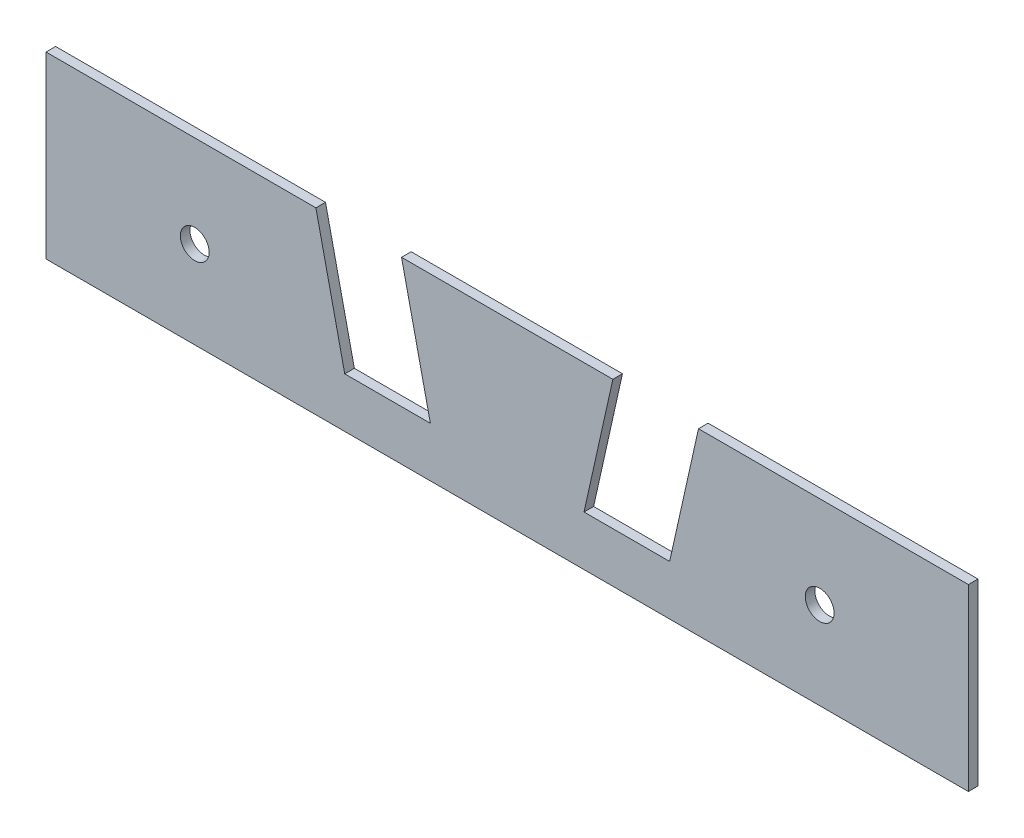
ISO-10303-21;
HEADER;
FILE_DESCRIPTION(('STEP AP214'),'2;1');
FILE_NAME('part.step','',(''),(''),'','','');
FILE_SCHEMA(('AUTOMOTIVE_DESIGN { 1 0 10303 214 1 1 1 1 }'));
ENDSEC;
DATA;
#1=APPLICATION_CONTEXT('core data for automotive mechanical design processes');
#2=APPLICATION_PROTOCOL_DEFINITION('international standard','automotive_design',2000,#1);
#3=PRODUCT_CONTEXT('',#1,'mechanical');
#4=PRODUCT('Part','Part','',(#3));
#5=PRODUCT_RELATED_PRODUCT_CATEGORY('part','',(#4));
#6=PRODUCT_DEFINITION_FORMATION('','',#4);
#7=PRODUCT_DEFINITION_CONTEXT('part definition',#1,'design');
#8=PRODUCT_DEFINITION('design','',#6,#7);
#9=PRODUCT_DEFINITION_SHAPE('','',#8);
#10=(LENGTH_UNIT() NAMED_UNIT(*) SI_UNIT(.MILLI.,.METRE.));
#11=(NAMED_UNIT(*) PLANE_ANGLE_UNIT() SI_UNIT($,.RADIAN.));
#12=(NAMED_UNIT(*) SI_UNIT($,.STERADIAN.) SOLID_ANGLE_UNIT());
#13=UNCERTAINTY_MEASURE_WITH_UNIT(LENGTH_MEASURE(1.E-05),#10,'distance_accuracy_value','');
#14=(GEOMETRIC_REPRESENTATION_CONTEXT(3) GLOBAL_UNCERTAINTY_ASSIGNED_CONTEXT((#13)) GLOBAL_UNIT_ASSIGNED_CONTEXT((#10,
#11,#12)) REPRESENTATION_CONTEXT('',''));
#15=CARTESIAN_POINT('',(0.,0.,0.));
#16=DIRECTION('',(0.,0.,1.));
#17=DIRECTION('',(1.,0.,0.));
#18=AXIS2_PLACEMENT_3D('',#15,#16,#17);
#19=CARTESIAN_POINT('',(0.,-34.7962109445084,1.));
#20=DIRECTION('',(0.,1.,0.));
#21=DIRECTION('',(0.,0.,1.));
#22=AXIS2_PLACEMENT_3D('',#19,#20,#21);
#23=PLANE('',#22);
#24=DIRECTION('',(1.,0.,0.));
#25=VECTOR('',#24,1.);
#26=CARTESIAN_POINT('',(0.,-34.7962109445084,0.));
#27=LINE('',#26,#25);
#28=CARTESIAN_POINT('',(19.9097439590473,-34.7962109445084,0.));
#29=VERTEX_POINT('',#28);
#30=CARTESIAN_POINT('',(47.9999999999996,-34.7962109445084,0.));
#31=VERTEX_POINT('',#30);
#32=EDGE_CURVE('E182',#29,#31,#27,.T.);
#33=ORIENTED_EDGE('',*,*,#32,.F.);
#34=DIRECTION('',(0.,0.,-1.));
#35=VECTOR('',#34,1.);
#36=CARTESIAN_POINT('',(19.9097439590473,-34.7962109445084,1.));
#37=LINE('',#36,#35);
#38=CARTESIAN_POINT('',(19.9097439590473,-34.7962109445084,1.));
#39=VERTEX_POINT('',#38);
#40=EDGE_CURVE('E11',#39,#29,#37,.T.);
#41=ORIENTED_EDGE('',*,*,#40,.F.);
#42=DIRECTION('',(1.,0.,0.));
#43=VECTOR('',#42,1.);
#44=CARTESIAN_POINT('',(0.,-34.7962109445084,1.));
#45=LINE('',#44,#43);
#46=CARTESIAN_POINT('',(47.9999999999996,-34.7962109445084,1.));
#47=VERTEX_POINT('',#46);
#48=EDGE_CURVE('E401',#39,#47,#45,.T.);
#49=ORIENTED_EDGE('',*,*,#48,.T.);
#50=DIRECTION('',(0.,0.,-1.));
#51=VECTOR('',#50,1.);
#52=CARTESIAN_POINT('',(47.9999999999996,-34.7962109445084,1.));
#53=LINE('',#52,#51);
#54=EDGE_CURVE('E52',#47,#31,#53,.T.);
#55=ORIENTED_EDGE('',*,*,#54,.T.);
#56=EDGE_LOOP('',(#33,#41,#49,#55));
#57=FACE_BOUND('',#56,.T.);
#58=ADVANCED_FACE('F35',(#57),#23,.T.);
#59=CARTESIAN_POINT('',(26.3574168754665,-5.87638376545327,1.));
#60=DIRECTION('',(-0.97603641935958,0.217607233528049,0.));
#61=DIRECTION('',(-0.217607233528049,-0.97603641935958,0.));
#62=AXIS2_PLACEMENT_3D('',#59,#60,#61);
#63=PLANE('',#62);
#64=DIRECTION('',(0.217607233528049,0.97603641935958,0.));
#65=VECTOR('',#64,1.);
#66=CARTESIAN_POINT('',(26.3574168754665,-5.87638376545327,0.));
#67=LINE('',#66,#65);
#68=CARTESIAN_POINT('',(16.9077593518572,-48.2610496792776,0.));
#69=VERTEX_POINT('',#68);
#70=EDGE_CURVE('E179',#69,#29,#67,.T.);
#71=ORIENTED_EDGE('',*,*,#70,.F.);
#72=DIRECTION('',(0.,0.,-1.));
#73=VECTOR('',#72,1.);
#74=CARTESIAN_POINT('',(16.9077593518572,-48.2610496792776,1.));
#75=LINE('',#74,#73);
#76=CARTESIAN_POINT('',(16.9077593518572,-48.2610496792776,1.));
#77=VERTEX_POINT('',#76);
#78=EDGE_CURVE('E44',#77,#69,#75,.T.);
#79=ORIENTED_EDGE('',*,*,#78,.F.);
#80=DIRECTION('',(0.217607233528049,0.97603641935958,0.));
#81=VECTOR('',#80,1.);
#82=CARTESIAN_POINT('',(26.3574168754665,-5.87638376545327,1.));
#83=LINE('',#82,#81);
#84=EDGE_CURVE('E399',#77,#39,#83,.T.);
#85=ORIENTED_EDGE('',*,*,#84,.T.);
#86=ORIENTED_EDGE('',*,*,#40,.T.);
#87=EDGE_LOOP('',(#71,#79,#85,#86));
#88=FACE_BOUND('',#87,.T.);
#89=ADVANCED_FACE('F180',(#88),#63,.T.);
#90=CARTESIAN_POINT('',(0.,-48.2610496792776,1.));
#91=DIRECTION('',(0.,1.,0.));
#92=DIRECTION('',(0.,0.,1.));
#93=AXIS2_PLACEMENT_3D('',#90,#91,#92);
#94=PLANE('',#93);
#95=DIRECTION('',(1.,0.,0.));
#96=VECTOR('',#95,1.);
#97=CARTESIAN_POINT('',(0.,-48.2610496792776,0.));
#98=LINE('',#97,#96);
#99=CARTESIAN_POINT('',(7.99526178816026,-48.2610496792776,0.));
#100=VERTEX_POINT('',#99);
#101=EDGE_CURVE('E171',#100,#69,#98,.T.);
#102=ORIENTED_EDGE('',*,*,#101,.F.);
#103=DIRECTION('',(0.,0.,-1.));
#104=VECTOR('',#103,1.);
#105=CARTESIAN_POINT('',(7.99526178816026,-48.2610496792776,1.));
#106=LINE('',#105,#104);
#107=CARTESIAN_POINT('',(7.99526178816026,-48.2610496792776,1.));
#108=VERTEX_POINT('',#107);
#109=EDGE_CURVE('E164',#108,#100,#106,.T.);
#110=ORIENTED_EDGE('',*,*,#109,.F.);
#111=DIRECTION('',(1.,0.,0.));
#112=VECTOR('',#111,1.);
#113=CARTESIAN_POINT('',(0.,-48.2610496792776,1.));
#114=LINE('',#113,#112);
#115=EDGE_CURVE('E174',#108,#77,#114,.T.);
#116=ORIENTED_EDGE('',*,*,#115,.T.);
#117=ORIENTED_EDGE('',*,*,#78,.T.);
#118=EDGE_LOOP('',(#102,#110,#116,#117));
#119=FACE_BOUND('',#118,.T.);
#120=ADVANCED_FACE('F169',(#119),#94,.T.);
#121=CARTESIAN_POINT('',(17.8669519896998,-3.98343536874179,1.));
#122=DIRECTION('',(0.97603641935958,-0.217607233528049,0.));
#123=DIRECTION('',(0.217607233528049,0.97603641935958,0.));
#124=AXIS2_PLACEMENT_3D('',#121,#122,#123);
#125=PLANE('',#124);
#126=DIRECTION('',(-0.217607233528049,-0.97603641935958,0.));
#127=VECTOR('',#126,1.);
#128=CARTESIAN_POINT('',(17.8669519896998,-3.98343536874179,0.));
#129=LINE('',#128,#127);
#130=CARTESIAN_POINT('',(10.9972463953504,-34.7962109445084,0.));
#131=VERTEX_POINT('',#130);
#132=EDGE_CURVE('E187',#131,#100,#129,.T.);
#133=ORIENTED_EDGE('',*,*,#132,.F.);
#134=DIRECTION('',(0.,0.,-1.));
#135=VECTOR('',#134,1.);
#136=CARTESIAN_POINT('',(10.9972463953504,-34.7962109445084,1.));
#137=LINE('',#136,#135);
#138=CARTESIAN_POINT('',(10.9972463953504,-34.7962109445084,1.));
#139=VERTEX_POINT('',#138);
#140=EDGE_CURVE('E162',#139,#131,#137,.T.);
#141=ORIENTED_EDGE('',*,*,#140,.F.);
#142=DIRECTION('',(-0.217607233528049,-0.97603641935958,0.));
#143=VECTOR('',#142,1.);
#144=CARTESIAN_POINT('',(17.8669519896998,-3.98343536874179,1.));
#145=LINE('',#144,#143);
#146=EDGE_CURVE('E382',#139,#108,#145,.T.);
#147=ORIENTED_EDGE('',*,*,#146,.T.);
#148=ORIENTED_EDGE('',*,*,#109,.T.);
#149=EDGE_LOOP('',(#133,#141,#147,#148));
#150=FACE_BOUND('',#149,.T.);
#151=ADVANCED_FACE('F338',(#150),#125,.T.);
#152=CARTESIAN_POINT('',(0.,-34.7962109445084,1.));
#153=DIRECTION('',(0.,1.,0.));
#154=DIRECTION('',(0.,0.,1.));
#155=AXIS2_PLACEMENT_3D('',#152,#153,#154);
#156=PLANE('',#155);
#157=DIRECTION('',(1.,0.,0.));
#158=VECTOR('',#157,1.);
#159=CARTESIAN_POINT('',(0.,-34.7962109445084,0.));
#160=LINE('',#159,#158);
#161=CARTESIAN_POINT('',(-10.9972463953504,-34.7962109445084,0.));
#162=VERTEX_POINT('',#161);
#163=EDGE_CURVE('E189',#162,#131,#160,.T.);
#164=ORIENTED_EDGE('',*,*,#163,.F.);
#165=DIRECTION('',(0.,0.,-1.));
#166=VECTOR('',#165,1.);
#167=CARTESIAN_POINT('',(-10.9972463953504,-34.7962109445084,1.));
#168=LINE('',#167,#166);
#169=CARTESIAN_POINT('',(-10.9972463953504,-34.7962109445084,1.));
#170=VERTEX_POINT('',#169);
#171=EDGE_CURVE('E160',#170,#162,#168,.T.);
#172=ORIENTED_EDGE('',*,*,#171,.F.);
#173=DIRECTION('',(1.,0.,0.));
#174=VECTOR('',#173,1.);
#175=CARTESIAN_POINT('',(0.,-34.7962109445084,1.));
#176=LINE('',#175,#174);
#177=EDGE_CURVE('E378',#170,#139,#176,.T.);
#178=ORIENTED_EDGE('',*,*,#177,.T.);
#179=ORIENTED_EDGE('',*,*,#140,.T.);
#180=EDGE_LOOP('',(#164,#172,#178,#179));
#181=FACE_BOUND('',#180,.T.);
#182=ADVANCED_FACE('F328',(#181),#156,.T.);
#183=CARTESIAN_POINT('',(-17.8669519896996,-3.98343536874167,1.));
#184=DIRECTION('',(-0.976036419359581,-0.217607233528045,0.));
#185=DIRECTION('',(0.217607233528045,-0.976036419359581,0.));
#186=AXIS2_PLACEMENT_3D('',#183,#184,#185);
#187=PLANE('',#186);
#188=DIRECTION('',(-0.217607233528045,0.976036419359581,0.));
#189=VECTOR('',#188,1.);
#190=CARTESIAN_POINT('',(-17.8669519896996,-3.98343536874167,0.));
#191=LINE('',#190,#189);
#192=CARTESIAN_POINT('',(-7.99526178816029,-48.2610496792776,0.));
#193=VERTEX_POINT('',#192);
#194=EDGE_CURVE('E194',#193,#162,#191,.T.);
#195=ORIENTED_EDGE('',*,*,#194,.F.);
#196=DIRECTION('',(0.,0.,-1.));
#197=VECTOR('',#196,1.);
#198=CARTESIAN_POINT('',(-7.99526178816029,-48.2610496792776,1.));
#199=LINE('',#198,#197);
#200=CARTESIAN_POINT('',(-7.99526178816029,-48.2610496792776,1.));
#201=VERTEX_POINT('',#200);
#202=EDGE_CURVE('E158',#201,#193,#199,.T.);
#203=ORIENTED_EDGE('',*,*,#202,.F.);
#204=DIRECTION('',(-0.217607233528045,0.976036419359581,0.));
#205=VECTOR('',#204,1.);
#206=CARTESIAN_POINT('',(-17.8669519896996,-3.98343536874167,1.));
#207=LINE('',#206,#205);
#208=EDGE_CURVE('E381',#201,#170,#207,.T.);
#209=ORIENTED_EDGE('',*,*,#208,.T.);
#210=ORIENTED_EDGE('',*,*,#171,.T.);
#211=EDGE_LOOP('',(#195,#203,#209,#210));
#212=FACE_BOUND('',#211,.T.);
#213=ADVANCED_FACE('F318',(#212),#187,.T.);
#214=CARTESIAN_POINT('',(0.,-48.2610496792776,1.));
#215=DIRECTION('',(0.,1.,0.));
#216=DIRECTION('',(0.,0.,1.));
#217=AXIS2_PLACEMENT_3D('',#214,#215,#216);
#218=PLANE('',#217);
#219=DIRECTION('',(1.,0.,0.));
#220=VECTOR('',#219,1.);
#221=CARTESIAN_POINT('',(0.,-48.2610496792776,0.));
#222=LINE('',#221,#220);
#223=CARTESIAN_POINT('',(-16.9077593518572,-48.2610496792776,0.));
#224=VERTEX_POINT('',#223);
#225=EDGE_CURVE('E197',#224,#193,#222,.T.);
#226=ORIENTED_EDGE('',*,*,#225,.F.);
#227=DIRECTION('',(0.,0.,-1.));
#228=VECTOR('',#227,1.);
#229=CARTESIAN_POINT('',(-16.9077593518572,-48.2610496792776,1.));
#230=LINE('',#229,#228);
#231=CARTESIAN_POINT('',(-16.9077593518572,-48.2610496792776,1.));
#232=VERTEX_POINT('',#231);
#233=EDGE_CURVE('E156',#232,#224,#230,.T.);
#234=ORIENTED_EDGE('',*,*,#233,.F.);
#235=DIRECTION('',(1.,0.,0.));
#236=VECTOR('',#235,1.);
#237=CARTESIAN_POINT('',(0.,-48.2610496792776,1.));
#238=LINE('',#237,#236);
#239=EDGE_CURVE('E384',#232,#201,#238,.T.);
#240=ORIENTED_EDGE('',*,*,#239,.T.);
#241=ORIENTED_EDGE('',*,*,#202,.T.);
#242=EDGE_LOOP('',(#226,#234,#240,#241));
#243=FACE_BOUND('',#242,.T.);
#244=ADVANCED_FACE('F308',(#243),#218,.T.);
#245=CARTESIAN_POINT('',(-26.3574168754663,-5.87638376545311,1.));
#246=DIRECTION('',(0.976036419359581,0.217607233528045,0.));
#247=DIRECTION('',(-0.217607233528045,0.976036419359581,0.));
#248=AXIS2_PLACEMENT_3D('',#245,#246,#247);
#249=PLANE('',#248);
#250=DIRECTION('',(0.217607233528045,-0.976036419359581,0.));
#251=VECTOR('',#250,1.);
#252=CARTESIAN_POINT('',(-26.3574168754663,-5.87638376545311,0.));
#253=LINE('',#252,#251);
#254=CARTESIAN_POINT('',(-19.9097439590473,-34.7962109445084,0.));
#255=VERTEX_POINT('',#254);
#256=EDGE_CURVE('E200',#255,#224,#253,.T.);
#257=ORIENTED_EDGE('',*,*,#256,.F.);
#258=DIRECTION('',(0.,0.,-1.));
#259=VECTOR('',#258,1.);
#260=CARTESIAN_POINT('',(-19.9097439590473,-34.7962109445084,1.));
#261=LINE('',#260,#259);
#262=CARTESIAN_POINT('',(-19.9097439590473,-34.7962109445084,1.));
#263=VERTEX_POINT('',#262);
#264=EDGE_CURVE('E150',#263,#255,#261,.T.);
#265=ORIENTED_EDGE('',*,*,#264,.F.);
#266=DIRECTION('',(0.217607233528045,-0.976036419359581,0.));
#267=VECTOR('',#266,1.);
#268=CARTESIAN_POINT('',(-26.3574168754663,-5.87638376545311,1.));
#269=LINE('',#268,#267);
#270=EDGE_CURVE('E391',#263,#232,#269,.T.);
#271=ORIENTED_EDGE('',*,*,#270,.T.);
#272=ORIENTED_EDGE('',*,*,#233,.T.);
#273=EDGE_LOOP('',(#257,#265,#271,#272));
#274=FACE_BOUND('',#273,.T.);
#275=ADVANCED_FACE('F298',(#274),#249,.T.);
#276=CARTESIAN_POINT('',(0.,-34.7962109445084,1.));
#277=DIRECTION('',(0.,1.,0.));
#278=DIRECTION('',(0.,0.,1.));
#279=AXIS2_PLACEMENT_3D('',#276,#277,#278);
#280=PLANE('',#279);
#281=DIRECTION('',(1.,0.,0.));
#282=VECTOR('',#281,1.);
#283=CARTESIAN_POINT('',(0.,-34.7962109445084,0.));
#284=LINE('',#283,#282);
#285=CARTESIAN_POINT('',(-48.,-34.7962109445084,0.));
#286=VERTEX_POINT('',#285);
#287=EDGE_CURVE('E203',#286,#255,#284,.T.);
#288=ORIENTED_EDGE('',*,*,#287,.F.);
#289=DIRECTION('',(0.,0.,-1.));
#290=VECTOR('',#289,1.);
#291=CARTESIAN_POINT('',(-48.,-34.7962109445084,1.));
#292=LINE('',#291,#290);
#293=CARTESIAN_POINT('',(-48.,-34.7962109445084,1.));
#294=VERTEX_POINT('',#293);
#295=EDGE_CURVE('E148',#294,#286,#292,.T.);
#296=ORIENTED_EDGE('',*,*,#295,.F.);
#297=DIRECTION('',(1.,0.,0.));
#298=VECTOR('',#297,1.);
#299=CARTESIAN_POINT('',(0.,-34.7962109445084,1.));
#300=LINE('',#299,#298);
#301=EDGE_CURVE('E142',#294,#263,#300,.T.);
#302=ORIENTED_EDGE('',*,*,#301,.T.);
#303=ORIENTED_EDGE('',*,*,#264,.T.);
#304=EDGE_LOOP('',(#288,#296,#302,#303));
#305=FACE_BOUND('',#304,.T.);
#306=ADVANCED_FACE('F289',(#305),#280,.T.);
#307=CARTESIAN_POINT('',(-48.,0.,1.));
#308=DIRECTION('',(1.,0.,0.));
#309=DIRECTION('',(0.,0.,-1.));
#310=AXIS2_PLACEMENT_3D('',#307,#308,#309);
#311=PLANE('',#310);
#312=DIRECTION('',(0.,-1.,0.));
#313=VECTOR('',#312,1.);
#314=CARTESIAN_POINT('',(-48.,0.,0.));
#315=LINE('',#314,#313);
#316=CARTESIAN_POINT('',(-48.,-53.4541908011831,0.));
#317=VERTEX_POINT('',#316);
#318=EDGE_CURVE('E147',#286,#317,#315,.T.);
#319=ORIENTED_EDGE('',*,*,#318,.T.);
#320=DIRECTION('',(0.,0.,-1.));
#321=VECTOR('',#320,1.);
#322=CARTESIAN_POINT('',(-48.,-53.4541908011831,1.));
#323=LINE('',#322,#321);
#324=CARTESIAN_POINT('',(-48.,-53.4541908011831,1.));
#325=VERTEX_POINT('',#324);
#326=EDGE_CURVE('E130',#325,#317,#323,.T.);
#327=ORIENTED_EDGE('',*,*,#326,.F.);
#328=DIRECTION('',(0.,-1.,0.));
#329=VECTOR('',#328,1.);
#330=CARTESIAN_POINT('',(-48.,0.,1.));
#331=LINE('',#330,#329);
#332=EDGE_CURVE('E135',#294,#325,#331,.T.);
#333=ORIENTED_EDGE('',*,*,#332,.F.);
#334=ORIENTED_EDGE('',*,*,#295,.T.);
#335=EDGE_LOOP('',(#319,#327,#333,#334));
#336=FACE_BOUND('',#335,.T.);
#337=ADVANCED_FACE('F145',(#336),#311,.F.);
#338=CARTESIAN_POINT('',(0.,-53.4541908011831,1.));
#339=DIRECTION('',(0.,1.,0.));
#340=DIRECTION('',(0.,0.,1.));
#341=AXIS2_PLACEMENT_3D('',#338,#339,#340);
#342=PLANE('',#341);
#343=DIRECTION('',(1.,0.,0.));
#344=VECTOR('',#343,1.);
#345=CARTESIAN_POINT('',(0.,-53.4541908011831,0.));
#346=LINE('',#345,#344);
#347=CARTESIAN_POINT('',(47.9999999999996,-53.4541908011831,0.));
#348=VERTEX_POINT('',#347);
#349=EDGE_CURVE('E207',#317,#348,#346,.T.);
#350=ORIENTED_EDGE('',*,*,#349,.T.);
#351=DIRECTION('',(0.,0.,-1.));
#352=VECTOR('',#351,1.);
#353=CARTESIAN_POINT('',(47.9999999999996,-53.4541908011831,1.));
#354=LINE('',#353,#352);
#355=CARTESIAN_POINT('',(47.9999999999996,-53.4541908011831,1.));
#356=VERTEX_POINT('',#355);
#357=EDGE_CURVE('E90',#356,#348,#354,.T.);
#358=ORIENTED_EDGE('',*,*,#357,.F.);
#359=DIRECTION('',(1.,0.,0.));
#360=VECTOR('',#359,1.);
#361=CARTESIAN_POINT('',(0.,-53.4541908011831,1.));
#362=LINE('',#361,#360);
#363=EDGE_CURVE('E126',#325,#356,#362,.T.);
#364=ORIENTED_EDGE('',*,*,#363,.F.);
#365=ORIENTED_EDGE('',*,*,#326,.T.);
#366=EDGE_LOOP('',(#350,#358,#364,#365));
#367=FACE_BOUND('',#366,.T.);
#368=ADVANCED_FACE('F128',(#367),#342,.F.);
#369=CARTESIAN_POINT('',(32.5214479514733,-44.3645293283665,1.));
#370=DIRECTION('',(0.,0.,-1.));
#371=DIRECTION('',(-1.,0.,0.));
#372=AXIS2_PLACEMENT_3D('',#369,#370,#371);
#373=CYLINDRICAL_SURFACE('',#372,1.5);
#374=CARTESIAN_POINT('',(32.5214479514733,-44.3645293283665,1.));
#375=DIRECTION('',(0.,0.,1.));
#376=DIRECTION('',(1.,0.,0.));
#377=AXIS2_PLACEMENT_3D('',#374,#375,#376);
#378=CIRCLE('',#377,1.5);
#379=CARTESIAN_POINT('',(34.0214479514733,-44.3645293283665,1.));
#380=VERTEX_POINT('',#379);
#381=EDGE_CURVE('E247',#380,#380,#378,.T.);
#382=ORIENTED_EDGE('',*,*,#381,.T.);
#383=EDGE_LOOP('',(#382));
#384=FACE_BOUND('',#383,.T.);
#385=CARTESIAN_POINT('',(32.5214479514733,-44.3645293283665,0.));
#386=DIRECTION('',(0.,0.,1.));
#387=DIRECTION('',(1.,0.,0.));
#388=AXIS2_PLACEMENT_3D('',#385,#386,#387);
#389=CIRCLE('',#388,1.5);
#390=CARTESIAN_POINT('',(34.0214479514733,-44.3645293283665,0.));
#391=VERTEX_POINT('',#390);
#392=EDGE_CURVE('E217',#391,#391,#389,.T.);
#393=ORIENTED_EDGE('',*,*,#392,.F.);
#394=EDGE_LOOP('',(#393));
#395=FACE_BOUND('',#394,.T.);
#396=ADVANCED_FACE('F228',(#384,#395),#373,.F.);
#397=CARTESIAN_POINT('',(-32.5214479514741,-44.3645293283665,1.));
#398=DIRECTION('',(0.,0.,-1.));
#399=DIRECTION('',(-1.,0.,0.));
#400=AXIS2_PLACEMENT_3D('',#397,#398,#399);
#401=CYLINDRICAL_SURFACE('',#400,1.5);
#402=CARTESIAN_POINT('',(-32.5214479514741,-44.3645293283665,1.));
#403=DIRECTION('',(0.,0.,1.));
#404=DIRECTION('',(1.,0.,0.));
#405=AXIS2_PLACEMENT_3D('',#402,#403,#404);
#406=CIRCLE('',#405,1.5);
#407=CARTESIAN_POINT('',(-31.0214479514741,-44.3645293283665,1.));
#408=VERTEX_POINT('',#407);
#409=EDGE_CURVE('E211',#408,#408,#406,.T.);
#410=ORIENTED_EDGE('',*,*,#409,.T.);
#411=EDGE_LOOP('',(#410));
#412=FACE_BOUND('',#411,.T.);
#413=CARTESIAN_POINT('',(-32.5214479514741,-44.3645293283665,0.));
#414=DIRECTION('',(0.,0.,1.));
#415=DIRECTION('',(1.,0.,0.));
#416=AXIS2_PLACEMENT_3D('',#413,#414,#415);
#417=CIRCLE('',#416,1.5);
#418=CARTESIAN_POINT('',(-31.0214479514741,-44.3645293283665,0.));
#419=VERTEX_POINT('',#418);
#420=EDGE_CURVE('E214',#419,#419,#417,.T.);
#421=ORIENTED_EDGE('',*,*,#420,.F.);
#422=EDGE_LOOP('',(#421));
#423=FACE_BOUND('',#422,.T.);
#424=ADVANCED_FACE('F37',(#412,#423),#401,.F.);
#425=CARTESIAN_POINT('',(47.9999999999996,0.,1.));
#426=DIRECTION('',(1.,0.,0.));
#427=DIRECTION('',(0.,0.,-1.));
#428=AXIS2_PLACEMENT_3D('',#425,#426,#427);
#429=PLANE('',#428);
#430=DIRECTION('',(0.,-1.,0.));
#431=VECTOR('',#430,1.);
#432=CARTESIAN_POINT('',(47.9999999999996,0.,0.));
#433=LINE('',#432,#431);
#434=EDGE_CURVE('E209',#31,#348,#433,.T.);
#435=ORIENTED_EDGE('',*,*,#434,.F.);
#436=ORIENTED_EDGE('',*,*,#54,.F.);
#437=DIRECTION('',(0.,-1.,0.));
#438=VECTOR('',#437,1.);
#439=CARTESIAN_POINT('',(47.9999999999996,0.,1.));
#440=LINE('',#439,#438);
#441=EDGE_CURVE('E134',#47,#356,#440,.T.);
#442=ORIENTED_EDGE('',*,*,#441,.T.);
#443=ORIENTED_EDGE('',*,*,#357,.T.);
#444=EDGE_LOOP('',(#435,#436,#442,#443));
#445=FACE_BOUND('',#444,.T.);
#446=ADVANCED_FACE('F219',(#445),#429,.T.);
#447=CARTESIAN_POINT('',(0.,0.,1.));
#448=DIRECTION('',(0.,0.,1.));
#449=DIRECTION('',(1.,0.,0.));
#450=AXIS2_PLACEMENT_3D('',#447,#448,#449);
#451=PLANE('',#450);
#452=ORIENTED_EDGE('',*,*,#409,.F.);
#453=EDGE_LOOP('',(#452));
#454=FACE_BOUND('',#453,.T.);
#455=ORIENTED_EDGE('',*,*,#381,.F.);
#456=EDGE_LOOP('',(#455));
#457=FACE_BOUND('',#456,.T.);
#458=ORIENTED_EDGE('',*,*,#48,.F.);
#459=ORIENTED_EDGE('',*,*,#84,.F.);
#460=ORIENTED_EDGE('',*,*,#115,.F.);
#461=ORIENTED_EDGE('',*,*,#146,.F.);
#462=ORIENTED_EDGE('',*,*,#177,.F.);
#463=ORIENTED_EDGE('',*,*,#208,.F.);
#464=ORIENTED_EDGE('',*,*,#239,.F.);
#465=ORIENTED_EDGE('',*,*,#270,.F.);
#466=ORIENTED_EDGE('',*,*,#301,.F.);
#467=ORIENTED_EDGE('',*,*,#332,.T.);
#468=ORIENTED_EDGE('',*,*,#363,.T.);
#469=ORIENTED_EDGE('',*,*,#441,.F.);
#470=EDGE_LOOP('',(#458,#459,#460,#461,#462,#463,#464,#465,#466,#467,#468,#469));
#471=FACE_BOUND('',#470,.T.);
#472=ADVANCED_FACE('F139',(#454,#457,#471),#451,.T.);
#473=CARTESIAN_POINT('',(0.,0.,0.));
#474=DIRECTION('',(0.,0.,1.));
#475=DIRECTION('',(1.,0.,0.));
#476=AXIS2_PLACEMENT_3D('',#473,#474,#475);
#477=PLANE('',#476);
#478=ORIENTED_EDGE('',*,*,#420,.T.);
#479=EDGE_LOOP('',(#478));
#480=FACE_BOUND('',#479,.T.);
#481=ORIENTED_EDGE('',*,*,#392,.T.);
#482=EDGE_LOOP('',(#481));
#483=FACE_BOUND('',#482,.T.);
#484=ORIENTED_EDGE('',*,*,#32,.T.);
#485=ORIENTED_EDGE('',*,*,#434,.T.);
#486=ORIENTED_EDGE('',*,*,#349,.F.);
#487=ORIENTED_EDGE('',*,*,#318,.F.);
#488=ORIENTED_EDGE('',*,*,#287,.T.);
#489=ORIENTED_EDGE('',*,*,#256,.T.);
#490=ORIENTED_EDGE('',*,*,#225,.T.);
#491=ORIENTED_EDGE('',*,*,#194,.T.);
#492=ORIENTED_EDGE('',*,*,#163,.T.);
#493=ORIENTED_EDGE('',*,*,#132,.T.);
#494=ORIENTED_EDGE('',*,*,#101,.T.);
#495=ORIENTED_EDGE('',*,*,#70,.T.);
#496=EDGE_LOOP('',(#484,#485,#486,#487,#488,#489,#490,#491,#492,#493,#494,#495));
#497=FACE_BOUND('',#496,.T.);
#498=ADVANCED_FACE('F184',(#480,#483,#497),#477,.F.);
#499=CLOSED_SHELL('',(#58,#89,#120,#151,#182,#213,#244,#275,#306,#337,#368,#396,#424,#446,#472,#498));
#500=MANIFOLD_SOLID_BREP('B2',#499);
#501=ADVANCED_BREP_SHAPE_REPRESENTATION('',(#18,#500),#14);
#502=SHAPE_DEFINITION_REPRESENTATION(#9,#501);
ENDSEC;
END-ISO-10303-21;
